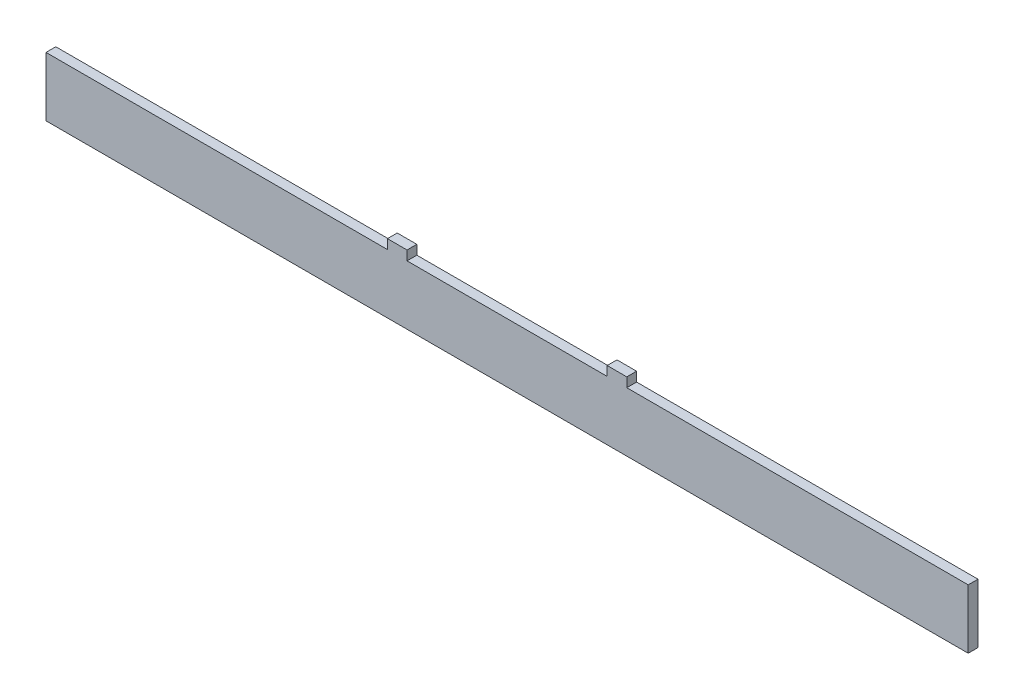
ISO-10303-21;
HEADER;
FILE_DESCRIPTION(('STEP AP214'),'2;1');
FILE_NAME('part.step','',(''),(''),'','','');
FILE_SCHEMA(('AUTOMOTIVE_DESIGN { 1 0 10303 214 1 1 1 1 }'));
ENDSEC;
DATA;
#1=APPLICATION_CONTEXT('core data for automotive mechanical design processes');
#2=APPLICATION_PROTOCOL_DEFINITION('international standard','automotive_design',2000,#1);
#3=PRODUCT_CONTEXT('',#1,'mechanical');
#4=PRODUCT('Part','Part','',(#3));
#5=PRODUCT_RELATED_PRODUCT_CATEGORY('part','',(#4));
#6=PRODUCT_DEFINITION_FORMATION('','',#4);
#7=PRODUCT_DEFINITION_CONTEXT('part definition',#1,'design');
#8=PRODUCT_DEFINITION('design','',#6,#7);
#9=PRODUCT_DEFINITION_SHAPE('','',#8);
#10=(LENGTH_UNIT() NAMED_UNIT(*) SI_UNIT(.MILLI.,.METRE.));
#11=(NAMED_UNIT(*) PLANE_ANGLE_UNIT() SI_UNIT($,.RADIAN.));
#12=(NAMED_UNIT(*) SI_UNIT($,.STERADIAN.) SOLID_ANGLE_UNIT());
#13=UNCERTAINTY_MEASURE_WITH_UNIT(LENGTH_MEASURE(1.E-05),#10,'distance_accuracy_value','');
#14=(GEOMETRIC_REPRESENTATION_CONTEXT(3) GLOBAL_UNCERTAINTY_ASSIGNED_CONTEXT((#13)) GLOBAL_UNIT_ASSIGNED_CONTEXT((#10,
#11,#12)) REPRESENTATION_CONTEXT('',''));
#15=CARTESIAN_POINT('',(0.,0.,0.));
#16=DIRECTION('',(0.,0.,1.));
#17=DIRECTION('',(1.,0.,0.));
#18=AXIS2_PLACEMENT_3D('',#15,#16,#17);
#19=CARTESIAN_POINT('',(0.,22.225,0.));
#20=DIRECTION('',(0.,-1.,0.));
#21=DIRECTION('',(0.,0.,-1.));
#22=AXIS2_PLACEMENT_3D('',#19,#20,#21);
#23=PLANE('',#22);
#24=DIRECTION('',(1.,0.,0.));
#25=VECTOR('',#24,1.);
#26=CARTESIAN_POINT('',(-149.225,22.225,1.5875));
#27=LINE('',#26,#25);
#28=CARTESIAN_POINT('',(32.3850000000004,22.225,1.5875));
#29=VERTEX_POINT('',#28);
#30=CARTESIAN_POINT('',(38.7350000000004,22.225,1.5875));
#31=VERTEX_POINT('',#30);
#32=EDGE_CURVE('E160',#29,#31,#27,.T.);
#33=ORIENTED_EDGE('',*,*,#32,.T.);
#34=DIRECTION('',(0.,0.,1.));
#35=VECTOR('',#34,1.);
#36=CARTESIAN_POINT('',(38.7350000000004,22.225,-1.58750000000001));
#37=LINE('',#36,#35);
#38=CARTESIAN_POINT('',(38.7350000000004,22.225,-1.58750000000001));
#39=VERTEX_POINT('',#38);
#40=EDGE_CURVE('E191',#39,#31,#37,.T.);
#41=ORIENTED_EDGE('',*,*,#40,.F.);
#42=DIRECTION('',(-1.,0.,0.));
#43=VECTOR('',#42,1.);
#44=CARTESIAN_POINT('',(-149.225,22.225,-1.58750000000001));
#45=LINE('',#44,#43);
#46=CARTESIAN_POINT('',(32.3850000000004,22.225,-1.58750000000001));
#47=VERTEX_POINT('',#46);
#48=EDGE_CURVE('E163',#39,#47,#45,.T.);
#49=ORIENTED_EDGE('',*,*,#48,.T.);
#50=DIRECTION('',(0.,0.,1.));
#51=VECTOR('',#50,1.);
#52=CARTESIAN_POINT('',(32.3850000000004,22.225,-1.58750000000001));
#53=LINE('',#52,#51);
#54=EDGE_CURVE('E166',#47,#29,#53,.T.);
#55=ORIENTED_EDGE('',*,*,#54,.T.);
#56=EDGE_LOOP('',(#33,#41,#49,#55));
#57=FACE_BOUND('',#56,.T.);
#58=ADVANCED_FACE('F33',(#57),#23,.F.);
#59=CARTESIAN_POINT('',(149.225,22.225,1.5875));
#60=DIRECTION('',(-1.,0.,0.));
#61=DIRECTION('',(0.,0.,1.));
#62=AXIS2_PLACEMENT_3D('',#59,#60,#61);
#63=PLANE('',#62);
#64=DIRECTION('',(0.,-1.,0.));
#65=VECTOR('',#64,1.);
#66=CARTESIAN_POINT('',(149.225,22.225,-1.58750000000001));
#67=LINE('',#66,#65);
#68=CARTESIAN_POINT('',(149.225,19.177,-1.58750000000001));
#69=VERTEX_POINT('',#68);
#70=CARTESIAN_POINT('',(149.225,0.,-1.58750000000001));
#71=VERTEX_POINT('',#70);
#72=EDGE_CURVE('E11',#69,#71,#67,.T.);
#73=ORIENTED_EDGE('',*,*,#72,.F.);
#74=DIRECTION('',(0.,0.,1.));
#75=VECTOR('',#74,1.);
#76=CARTESIAN_POINT('',(149.225,19.177,-1.58750000000001));
#77=LINE('',#76,#75);
#78=CARTESIAN_POINT('',(149.225,19.177,1.5875));
#79=VERTEX_POINT('',#78);
#80=EDGE_CURVE('E196',#69,#79,#77,.T.);
#81=ORIENTED_EDGE('',*,*,#80,.T.);
#82=DIRECTION('',(0.,-1.,0.));
#83=VECTOR('',#82,1.);
#84=CARTESIAN_POINT('',(149.225,22.225,1.5875));
#85=LINE('',#84,#83);
#86=CARTESIAN_POINT('',(149.225,0.,1.5875));
#87=VERTEX_POINT('',#86);
#88=EDGE_CURVE('E144',#79,#87,#85,.T.);
#89=ORIENTED_EDGE('',*,*,#88,.T.);
#90=DIRECTION('',(0.,0.,-1.));
#91=VECTOR('',#90,1.);
#92=CARTESIAN_POINT('',(149.225,0.,1.5875));
#93=LINE('',#92,#91);
#94=EDGE_CURVE('E156',#87,#71,#93,.T.);
#95=ORIENTED_EDGE('',*,*,#94,.T.);
#96=EDGE_LOOP('',(#73,#81,#89,#95));
#97=FACE_BOUND('',#96,.T.);
#98=ADVANCED_FACE('F35',(#97),#63,.F.);
#99=CARTESIAN_POINT('',(-149.225,22.225,-1.58750000000001));
#100=DIRECTION('',(0.,0.,1.));
#101=DIRECTION('',(1.,0.,0.));
#102=AXIS2_PLACEMENT_3D('',#99,#100,#101);
#103=PLANE('',#102);
#104=DIRECTION('',(1.,0.,0.));
#105=VECTOR('',#104,1.);
#106=CARTESIAN_POINT('',(-149.225,19.177,-1.58750000000001));
#107=LINE('',#106,#105);
#108=CARTESIAN_POINT('',(-149.225,19.177,-1.58750000000001));
#109=VERTEX_POINT('',#108);
#110=CARTESIAN_POINT('',(-38.7349999999996,19.177,-1.58750000000001));
#111=VERTEX_POINT('',#110);
#112=EDGE_CURVE('E120',#109,#111,#107,.T.);
#113=ORIENTED_EDGE('',*,*,#112,.T.);
#114=DIRECTION('',(0.,1.,0.));
#115=VECTOR('',#114,1.);
#116=CARTESIAN_POINT('',(-38.7349999999996,22.225,-1.58750000000001));
#117=LINE('',#116,#115);
#118=CARTESIAN_POINT('',(-38.7349999999996,22.225,-1.58750000000001));
#119=VERTEX_POINT('',#118);
#120=EDGE_CURVE('E131',#111,#119,#117,.T.);
#121=ORIENTED_EDGE('',*,*,#120,.T.);
#122=CARTESIAN_POINT('',(-32.3849999999996,22.225,-1.58750000000001));
#123=VERTEX_POINT('',#122);
#124=EDGE_CURVE('E152',#123,#119,#45,.T.);
#125=ORIENTED_EDGE('',*,*,#124,.F.);
#126=DIRECTION('',(0.,-1.,0.));
#127=VECTOR('',#126,1.);
#128=CARTESIAN_POINT('',(-32.3849999999996,19.177,-1.58750000000001));
#129=LINE('',#128,#127);
#130=CARTESIAN_POINT('',(-32.3849999999996,19.177,-1.58750000000001));
#131=VERTEX_POINT('',#130);
#132=EDGE_CURVE('E56',#123,#131,#129,.T.);
#133=ORIENTED_EDGE('',*,*,#132,.T.);
#134=DIRECTION('',(1.,0.,0.));
#135=VECTOR('',#134,1.);
#136=CARTESIAN_POINT('',(32.3850000000004,19.177,-1.58750000000001));
#137=LINE('',#136,#135);
#138=CARTESIAN_POINT('',(32.3850000000004,19.177,-1.58750000000001));
#139=VERTEX_POINT('',#138);
#140=EDGE_CURVE('E170',#131,#139,#137,.T.);
#141=ORIENTED_EDGE('',*,*,#140,.T.);
#142=DIRECTION('',(0.,1.,0.));
#143=VECTOR('',#142,1.);
#144=CARTESIAN_POINT('',(32.3850000000004,19.177,-1.58750000000001));
#145=LINE('',#144,#143);
#146=EDGE_CURVE('E180',#139,#47,#145,.T.);
#147=ORIENTED_EDGE('',*,*,#146,.T.);
#148=ORIENTED_EDGE('',*,*,#48,.F.);
#149=DIRECTION('',(0.,-1.,0.));
#150=VECTOR('',#149,1.);
#151=CARTESIAN_POINT('',(38.7350000000004,22.225,-1.58750000000001));
#152=LINE('',#151,#150);
#153=CARTESIAN_POINT('',(38.7350000000004,19.177,-1.58750000000001));
#154=VERTEX_POINT('',#153);
#155=EDGE_CURVE('E202',#39,#154,#152,.T.);
#156=ORIENTED_EDGE('',*,*,#155,.T.);
#157=DIRECTION('',(1.,0.,0.));
#158=VECTOR('',#157,1.);
#159=CARTESIAN_POINT('',(149.225,19.177,-1.58750000000001));
#160=LINE('',#159,#158);
#161=EDGE_CURVE('E194',#154,#69,#160,.T.);
#162=ORIENTED_EDGE('',*,*,#161,.T.);
#163=ORIENTED_EDGE('',*,*,#72,.T.);
#164=DIRECTION('',(-1.,0.,0.));
#165=VECTOR('',#164,1.);
#166=CARTESIAN_POINT('',(-149.225,0.,-1.58750000000001));
#167=LINE('',#166,#165);
#168=CARTESIAN_POINT('',(-149.225,0.,-1.58750000000001));
#169=VERTEX_POINT('',#168);
#170=EDGE_CURVE('E142',#71,#169,#167,.T.);
#171=ORIENTED_EDGE('',*,*,#170,.T.);
#172=DIRECTION('',(0.,-1.,0.));
#173=VECTOR('',#172,1.);
#174=CARTESIAN_POINT('',(-149.225,22.225,-1.58750000000001));
#175=LINE('',#174,#173);
#176=EDGE_CURVE('E41',#109,#169,#175,.T.);
#177=ORIENTED_EDGE('',*,*,#176,.F.);
#178=EDGE_LOOP('',(#113,#121,#125,#133,#141,#147,#148,#156,#162,#163,#171,#177));
#179=FACE_BOUND('',#178,.T.);
#180=ADVANCED_FACE('F140',(#179),#103,.F.);
#181=CARTESIAN_POINT('',(-149.225,22.225,1.5875));
#182=DIRECTION('',(1.,0.,0.));
#183=DIRECTION('',(0.,0.,-1.));
#184=AXIS2_PLACEMENT_3D('',#181,#182,#183);
#185=PLANE('',#184);
#186=DIRECTION('',(0.,-1.,0.));
#187=VECTOR('',#186,1.);
#188=CARTESIAN_POINT('',(-149.225,22.225,1.5875));
#189=LINE('',#188,#187);
#190=CARTESIAN_POINT('',(-149.225,19.177,1.5875));
#191=VERTEX_POINT('',#190);
#192=CARTESIAN_POINT('',(-149.225,0.,1.5875));
#193=VERTEX_POINT('',#192);
#194=EDGE_CURVE('E138',#191,#193,#189,.T.);
#195=ORIENTED_EDGE('',*,*,#194,.F.);
#196=DIRECTION('',(0.,0.,1.));
#197=VECTOR('',#196,1.);
#198=CARTESIAN_POINT('',(-149.225,19.177,-1.58750000000001));
#199=LINE('',#198,#197);
#200=EDGE_CURVE('E124',#109,#191,#199,.T.);
#201=ORIENTED_EDGE('',*,*,#200,.F.);
#202=ORIENTED_EDGE('',*,*,#176,.T.);
#203=DIRECTION('',(0.,0.,1.));
#204=VECTOR('',#203,1.);
#205=CARTESIAN_POINT('',(-149.225,0.,1.5875));
#206=LINE('',#205,#204);
#207=EDGE_CURVE('E153',#169,#193,#206,.T.);
#208=ORIENTED_EDGE('',*,*,#207,.T.);
#209=EDGE_LOOP('',(#195,#201,#202,#208));
#210=FACE_BOUND('',#209,.T.);
#211=ADVANCED_FACE('F135',(#210),#185,.F.);
#212=CARTESIAN_POINT('',(-149.225,22.225,1.5875));
#213=DIRECTION('',(0.,0.,-1.));
#214=DIRECTION('',(-1.,0.,0.));
#215=AXIS2_PLACEMENT_3D('',#212,#213,#214);
#216=PLANE('',#215);
#217=CARTESIAN_POINT('',(-38.7349999999996,22.225,1.5875));
#218=VERTEX_POINT('',#217);
#219=CARTESIAN_POINT('',(-32.3849999999996,22.225,1.5875));
#220=VERTEX_POINT('',#219);
#221=EDGE_CURVE('E148',#218,#220,#27,.T.);
#222=ORIENTED_EDGE('',*,*,#221,.F.);
#223=DIRECTION('',(0.,1.,0.));
#224=VECTOR('',#223,1.);
#225=CARTESIAN_POINT('',(-38.7349999999996,22.225,1.5875));
#226=LINE('',#225,#224);
#227=CARTESIAN_POINT('',(-38.7349999999996,19.177,1.5875));
#228=VERTEX_POINT('',#227);
#229=EDGE_CURVE('E48',#228,#218,#226,.T.);
#230=ORIENTED_EDGE('',*,*,#229,.F.);
#231=DIRECTION('',(1.,0.,0.));
#232=VECTOR('',#231,1.);
#233=CARTESIAN_POINT('',(-149.225,19.177,1.5875));
#234=LINE('',#233,#232);
#235=EDGE_CURVE('E199',#191,#228,#234,.T.);
#236=ORIENTED_EDGE('',*,*,#235,.F.);
#237=ORIENTED_EDGE('',*,*,#194,.T.);
#238=DIRECTION('',(1.,0.,0.));
#239=VECTOR('',#238,1.);
#240=CARTESIAN_POINT('',(-149.225,0.,1.5875));
#241=LINE('',#240,#239);
#242=EDGE_CURVE('E149',#193,#87,#241,.T.);
#243=ORIENTED_EDGE('',*,*,#242,.T.);
#244=ORIENTED_EDGE('',*,*,#88,.F.);
#245=DIRECTION('',(1.,0.,0.));
#246=VECTOR('',#245,1.);
#247=CARTESIAN_POINT('',(149.225,19.177,1.5875));
#248=LINE('',#247,#246);
#249=CARTESIAN_POINT('',(38.7350000000004,19.177,1.5875));
#250=VERTEX_POINT('',#249);
#251=EDGE_CURVE('E200',#250,#79,#248,.T.);
#252=ORIENTED_EDGE('',*,*,#251,.F.);
#253=DIRECTION('',(0.,-1.,0.));
#254=VECTOR('',#253,1.);
#255=CARTESIAN_POINT('',(38.7350000000004,22.225,1.5875));
#256=LINE('',#255,#254);
#257=EDGE_CURVE('E176',#31,#250,#256,.T.);
#258=ORIENTED_EDGE('',*,*,#257,.F.);
#259=ORIENTED_EDGE('',*,*,#32,.F.);
#260=DIRECTION('',(0.,1.,0.));
#261=VECTOR('',#260,1.);
#262=CARTESIAN_POINT('',(32.3850000000004,19.177,1.5875));
#263=LINE('',#262,#261);
#264=CARTESIAN_POINT('',(32.3850000000004,19.177,1.5875));
#265=VERTEX_POINT('',#264);
#266=EDGE_CURVE('E184',#265,#29,#263,.T.);
#267=ORIENTED_EDGE('',*,*,#266,.F.);
#268=DIRECTION('',(1.,0.,0.));
#269=VECTOR('',#268,1.);
#270=CARTESIAN_POINT('',(32.3850000000004,19.177,1.5875));
#271=LINE('',#270,#269);
#272=CARTESIAN_POINT('',(-32.3849999999996,19.177,1.5875));
#273=VERTEX_POINT('',#272);
#274=EDGE_CURVE('E177',#273,#265,#271,.T.);
#275=ORIENTED_EDGE('',*,*,#274,.F.);
#276=DIRECTION('',(0.,-1.,0.));
#277=VECTOR('',#276,1.);
#278=CARTESIAN_POINT('',(-32.3849999999996,19.177,1.5875));
#279=LINE('',#278,#277);
#280=EDGE_CURVE('E181',#220,#273,#279,.T.);
#281=ORIENTED_EDGE('',*,*,#280,.F.);
#282=EDGE_LOOP('',(#222,#230,#236,#237,#243,#244,#252,#258,#259,#267,#275,#281));
#283=FACE_BOUND('',#282,.T.);
#284=ADVANCED_FACE('F222',(#283),#216,.F.);
#285=ORIENTED_EDGE('',*,*,#124,.T.);
#286=DIRECTION('',(0.,0.,1.));
#287=VECTOR('',#286,1.);
#288=CARTESIAN_POINT('',(-38.7349999999996,22.225,-1.58750000000001));
#289=LINE('',#288,#287);
#290=EDGE_CURVE('E159',#119,#218,#289,.T.);
#291=ORIENTED_EDGE('',*,*,#290,.T.);
#292=ORIENTED_EDGE('',*,*,#221,.T.);
#293=DIRECTION('',(0.,0.,1.));
#294=VECTOR('',#293,1.);
#295=CARTESIAN_POINT('',(-32.3849999999996,22.225,-1.58750000000001));
#296=LINE('',#295,#294);
#297=EDGE_CURVE('E169',#123,#220,#296,.T.);
#298=ORIENTED_EDGE('',*,*,#297,.F.);
#299=EDGE_LOOP('',(#285,#291,#292,#298));
#300=FACE_BOUND('',#299,.T.);
#301=ADVANCED_FACE('F215',(#300),#23,.F.);
#302=CARTESIAN_POINT('',(0.,0.,0.));
#303=DIRECTION('',(0.,-1.,0.));
#304=DIRECTION('',(0.,0.,-1.));
#305=AXIS2_PLACEMENT_3D('',#302,#303,#304);
#306=PLANE('',#305);
#307=ORIENTED_EDGE('',*,*,#94,.F.);
#308=ORIENTED_EDGE('',*,*,#242,.F.);
#309=ORIENTED_EDGE('',*,*,#207,.F.);
#310=ORIENTED_EDGE('',*,*,#170,.F.);
#311=EDGE_LOOP('',(#307,#308,#309,#310));
#312=FACE_BOUND('',#311,.T.);
#313=ADVANCED_FACE('F246',(#312),#306,.T.);
#314=CARTESIAN_POINT('',(32.3850000000004,19.177,-1.58750000000001));
#315=DIRECTION('',(1.,0.,0.));
#316=DIRECTION('',(0.,0.,-1.));
#317=AXIS2_PLACEMENT_3D('',#314,#315,#316);
#318=PLANE('',#317);
#319=ORIENTED_EDGE('',*,*,#266,.T.);
#320=ORIENTED_EDGE('',*,*,#54,.F.);
#321=ORIENTED_EDGE('',*,*,#146,.F.);
#322=DIRECTION('',(0.,0.,1.));
#323=VECTOR('',#322,1.);
#324=CARTESIAN_POINT('',(32.3850000000004,19.177,-1.58750000000001));
#325=LINE('',#324,#323);
#326=EDGE_CURVE('E174',#139,#265,#325,.T.);
#327=ORIENTED_EDGE('',*,*,#326,.T.);
#328=EDGE_LOOP('',(#319,#320,#321,#327));
#329=FACE_BOUND('',#328,.T.);
#330=ADVANCED_FACE('F249',(#329),#318,.F.);
#331=CARTESIAN_POINT('',(32.3850000000004,19.177,-1.58750000000001));
#332=DIRECTION('',(0.,-1.,0.));
#333=DIRECTION('',(1.,0.,0.));
#334=AXIS2_PLACEMENT_3D('',#331,#332,#333);
#335=PLANE('',#334);
#336=ORIENTED_EDGE('',*,*,#274,.T.);
#337=ORIENTED_EDGE('',*,*,#326,.F.);
#338=ORIENTED_EDGE('',*,*,#140,.F.);
#339=DIRECTION('',(0.,0.,1.));
#340=VECTOR('',#339,1.);
#341=CARTESIAN_POINT('',(-32.3849999999996,19.177,-1.58750000000001));
#342=LINE('',#341,#340);
#343=EDGE_CURVE('E172',#131,#273,#342,.T.);
#344=ORIENTED_EDGE('',*,*,#343,.T.);
#345=EDGE_LOOP('',(#336,#337,#338,#344));
#346=FACE_BOUND('',#345,.T.);
#347=ADVANCED_FACE('F226',(#346),#335,.F.);
#348=CARTESIAN_POINT('',(-32.3849999999996,19.177,-1.58750000000001));
#349=DIRECTION('',(-1.,0.,0.));
#350=DIRECTION('',(0.,0.,1.));
#351=AXIS2_PLACEMENT_3D('',#348,#349,#350);
#352=PLANE('',#351);
#353=ORIENTED_EDGE('',*,*,#280,.T.);
#354=ORIENTED_EDGE('',*,*,#343,.F.);
#355=ORIENTED_EDGE('',*,*,#132,.F.);
#356=ORIENTED_EDGE('',*,*,#297,.T.);
#357=EDGE_LOOP('',(#353,#354,#355,#356));
#358=FACE_BOUND('',#357,.T.);
#359=ADVANCED_FACE('F219',(#358),#352,.F.);
#360=CARTESIAN_POINT('',(149.225,19.177,-1.58750000000001));
#361=DIRECTION('',(0.,-1.,0.));
#362=DIRECTION('',(1.,0.,0.));
#363=AXIS2_PLACEMENT_3D('',#360,#361,#362);
#364=PLANE('',#363);
#365=ORIENTED_EDGE('',*,*,#251,.T.);
#366=ORIENTED_EDGE('',*,*,#80,.F.);
#367=ORIENTED_EDGE('',*,*,#161,.F.);
#368=DIRECTION('',(0.,0.,1.));
#369=VECTOR('',#368,1.);
#370=CARTESIAN_POINT('',(38.7350000000004,19.177,-1.58750000000001));
#371=LINE('',#370,#369);
#372=EDGE_CURVE('E193',#154,#250,#371,.T.);
#373=ORIENTED_EDGE('',*,*,#372,.T.);
#374=EDGE_LOOP('',(#365,#366,#367,#373));
#375=FACE_BOUND('',#374,.T.);
#376=ADVANCED_FACE('F240',(#375),#364,.F.);
#377=CARTESIAN_POINT('',(38.7350000000004,22.225,-1.58750000000001));
#378=DIRECTION('',(-1.,0.,0.));
#379=DIRECTION('',(0.,-1.,0.));
#380=AXIS2_PLACEMENT_3D('',#377,#378,#379);
#381=PLANE('',#380);
#382=ORIENTED_EDGE('',*,*,#257,.T.);
#383=ORIENTED_EDGE('',*,*,#372,.F.);
#384=ORIENTED_EDGE('',*,*,#155,.F.);
#385=ORIENTED_EDGE('',*,*,#40,.T.);
#386=EDGE_LOOP('',(#382,#383,#384,#385));
#387=FACE_BOUND('',#386,.T.);
#388=ADVANCED_FACE('F236',(#387),#381,.F.);
#389=CARTESIAN_POINT('',(-38.7349999999996,22.225,-1.58750000000001));
#390=DIRECTION('',(1.,0.,0.));
#391=DIRECTION('',(0.,1.,0.));
#392=AXIS2_PLACEMENT_3D('',#389,#390,#391);
#393=PLANE('',#392);
#394=ORIENTED_EDGE('',*,*,#229,.T.);
#395=ORIENTED_EDGE('',*,*,#290,.F.);
#396=ORIENTED_EDGE('',*,*,#120,.F.);
#397=DIRECTION('',(0.,0.,1.));
#398=VECTOR('',#397,1.);
#399=CARTESIAN_POINT('',(-38.7349999999996,19.177,-1.58750000000001));
#400=LINE('',#399,#398);
#401=EDGE_CURVE('E126',#111,#228,#400,.T.);
#402=ORIENTED_EDGE('',*,*,#401,.T.);
#403=EDGE_LOOP('',(#394,#395,#396,#402));
#404=FACE_BOUND('',#403,.T.);
#405=ADVANCED_FACE('F269',(#404),#393,.F.);
#406=CARTESIAN_POINT('',(-149.225,19.177,-1.58750000000001));
#407=DIRECTION('',(0.,-1.,0.));
#408=DIRECTION('',(0.,0.,-1.));
#409=AXIS2_PLACEMENT_3D('',#406,#407,#408);
#410=PLANE('',#409);
#411=ORIENTED_EDGE('',*,*,#235,.T.);
#412=ORIENTED_EDGE('',*,*,#401,.F.);
#413=ORIENTED_EDGE('',*,*,#112,.F.);
#414=ORIENTED_EDGE('',*,*,#200,.T.);
#415=EDGE_LOOP('',(#411,#412,#413,#414));
#416=FACE_BOUND('',#415,.T.);
#417=ADVANCED_FACE('F123',(#416),#410,.F.);
#418=CLOSED_SHELL('',(#58,#98,#180,#211,#284,#301,#313,#330,#347,#359,#376,#388,#405,#417));
#419=MANIFOLD_SOLID_BREP('B2',#418);
#420=ADVANCED_BREP_SHAPE_REPRESENTATION('',(#18,#419),#14);
#421=SHAPE_DEFINITION_REPRESENTATION(#9,#420);
ENDSEC;
END-ISO-10303-21;
